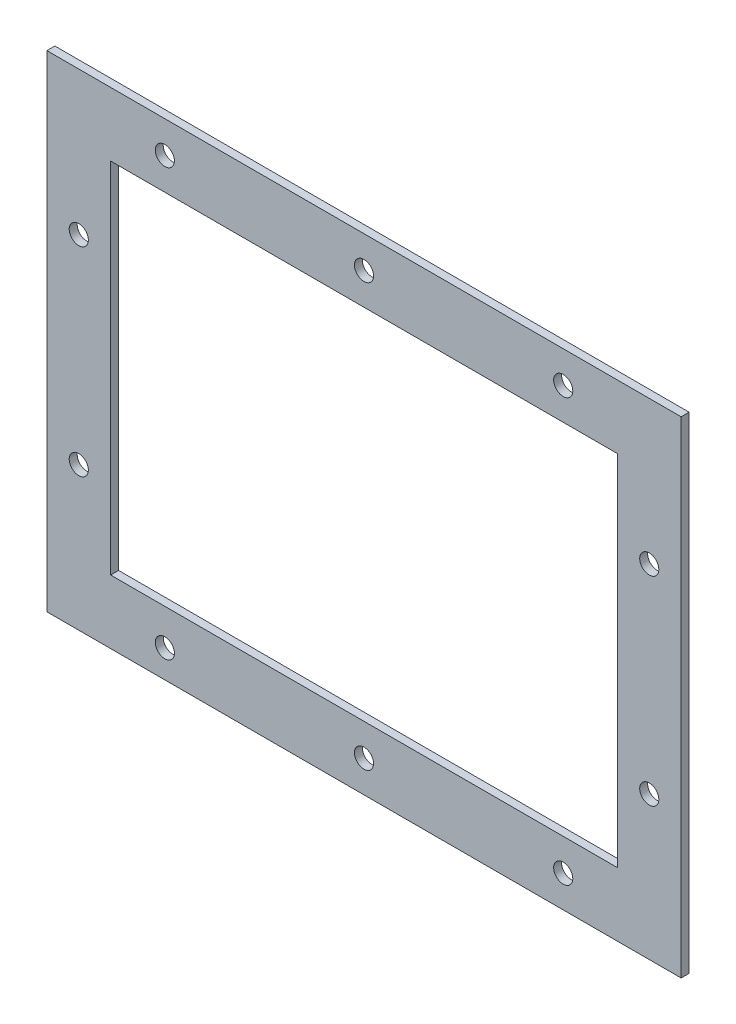
ISO-10303-21;
HEADER;
FILE_DESCRIPTION(('STEP AP214'),'2;1');
FILE_NAME('part.step','',(''),(''),'','','');
FILE_SCHEMA(('AUTOMOTIVE_DESIGN { 1 0 10303 214 1 1 1 1 }'));
ENDSEC;
DATA;
#1=APPLICATION_CONTEXT('core data for automotive mechanical design processes');
#2=APPLICATION_PROTOCOL_DEFINITION('international standard','automotive_design',2000,#1);
#3=PRODUCT_CONTEXT('',#1,'mechanical');
#4=PRODUCT('Part','Part','',(#3));
#5=PRODUCT_RELATED_PRODUCT_CATEGORY('part','',(#4));
#6=PRODUCT_DEFINITION_FORMATION('','',#4);
#7=PRODUCT_DEFINITION_CONTEXT('part definition',#1,'design');
#8=PRODUCT_DEFINITION('design','',#6,#7);
#9=PRODUCT_DEFINITION_SHAPE('','',#8);
#10=(LENGTH_UNIT() NAMED_UNIT(*) SI_UNIT(.MILLI.,.METRE.));
#11=(NAMED_UNIT(*) PLANE_ANGLE_UNIT() SI_UNIT($,.RADIAN.));
#12=(NAMED_UNIT(*) SI_UNIT($,.STERADIAN.) SOLID_ANGLE_UNIT());
#13=UNCERTAINTY_MEASURE_WITH_UNIT(LENGTH_MEASURE(1.E-05),#10,'distance_accuracy_value','');
#14=(GEOMETRIC_REPRESENTATION_CONTEXT(3) GLOBAL_UNCERTAINTY_ASSIGNED_CONTEXT((#13)) GLOBAL_UNIT_ASSIGNED_CONTEXT((#10,
#11,#12)) REPRESENTATION_CONTEXT('',''));
#15=CARTESIAN_POINT('',(0.,0.,0.));
#16=DIRECTION('',(0.,0.,1.));
#17=DIRECTION('',(1.,0.,0.));
#18=AXIS2_PLACEMENT_3D('',#15,#16,#17);
#19=CARTESIAN_POINT('',(0.,0.,5.));
#20=DIRECTION('',(0.,0.,1.));
#21=DIRECTION('',(1.,0.,0.));
#22=AXIS2_PLACEMENT_3D('',#19,#20,#21);
#23=PLANE('',#22);
#24=CARTESIAN_POINT('',(144.280112044818,-60.5,5.));
#25=DIRECTION('',(0.,0.,1.));
#26=DIRECTION('',(-1.,0.,0.));
#27=AXIS2_PLACEMENT_3D('',#24,#25,#26);
#28=CIRCLE('',#27,6.00000000000002);
#29=CARTESIAN_POINT('',(138.280112044818,-60.5,5.));
#30=VERTEX_POINT('',#29);
#31=EDGE_CURVE('E267',#30,#30,#28,.T.);
#32=ORIENTED_EDGE('',*,*,#31,.F.);
#33=EDGE_LOOP('',(#32));
#34=FACE_BOUND('',#33,.T.);
#35=CARTESIAN_POINT('',(-159.719887955182,134.5,5.));
#36=DIRECTION('',(0.,0.,1.));
#37=DIRECTION('',(1.,0.,0.));
#38=AXIS2_PLACEMENT_3D('',#35,#36,#37);
#39=CIRCLE('',#38,6.00000000000002);
#40=CARTESIAN_POINT('',(-153.719887955182,134.5,5.));
#41=VERTEX_POINT('',#40);
#42=EDGE_CURVE('E286',#41,#41,#39,.T.);
#43=ORIENTED_EDGE('',*,*,#42,.F.);
#44=EDGE_LOOP('',(#43));
#45=FACE_BOUND('',#44,.T.);
#46=CARTESIAN_POINT('',(90.2801120448178,-130.5,5.));
#47=DIRECTION('',(0.,0.,1.));
#48=DIRECTION('',(-1.,0.,0.));
#49=AXIS2_PLACEMENT_3D('',#46,#47,#48);
#50=CIRCLE('',#49,5.99999999999999);
#51=CARTESIAN_POINT('',(84.2801120448178,-130.5,5.));
#52=VERTEX_POINT('',#51);
#53=EDGE_CURVE('E280',#52,#52,#50,.T.);
#54=ORIENTED_EDGE('',*,*,#53,.F.);
#55=EDGE_LOOP('',(#54));
#56=FACE_BOUND('',#55,.T.);
#57=CARTESIAN_POINT('',(-34.7198879551822,-130.5,5.));
#58=DIRECTION('',(0.,0.,1.));
#59=DIRECTION('',(-1.,0.,0.));
#60=AXIS2_PLACEMENT_3D('',#57,#58,#59);
#61=CIRCLE('',#60,6.00000000000002);
#62=CARTESIAN_POINT('',(-40.7198879551822,-130.5,5.));
#63=VERTEX_POINT('',#62);
#64=EDGE_CURVE('E274',#63,#63,#61,.T.);
#65=ORIENTED_EDGE('',*,*,#64,.F.);
#66=EDGE_LOOP('',(#65));
#67=FACE_BOUND('',#66,.T.);
#68=CARTESIAN_POINT('',(-213.719887955182,-60.5,5.));
#69=DIRECTION('',(0.,0.,1.));
#70=DIRECTION('',(1.,0.,0.));
#71=AXIS2_PLACEMENT_3D('',#68,#69,#70);
#72=CIRCLE('',#71,6.00000000000002);
#73=CARTESIAN_POINT('',(-207.719887955182,-60.5,5.));
#74=VERTEX_POINT('',#73);
#75=EDGE_CURVE('E310',#74,#74,#72,.T.);
#76=ORIENTED_EDGE('',*,*,#75,.F.);
#77=EDGE_LOOP('',(#76));
#78=FACE_BOUND('',#77,.T.);
#79=CARTESIAN_POINT('',(90.2801120448178,134.5,5.));
#80=DIRECTION('',(0.,0.,1.));
#81=DIRECTION('',(1.,0.,0.));
#82=AXIS2_PLACEMENT_3D('',#79,#80,#81);
#83=CIRCLE('',#82,5.99999999999998);
#84=CARTESIAN_POINT('',(96.2801120448178,134.5,5.));
#85=VERTEX_POINT('',#84);
#86=EDGE_CURVE('E297',#85,#85,#83,.T.);
#87=ORIENTED_EDGE('',*,*,#86,.F.);
#88=EDGE_LOOP('',(#87));
#89=FACE_BOUND('',#88,.T.);
#90=CARTESIAN_POINT('',(-34.7198879551822,134.5,5.));
#91=DIRECTION('',(0.,0.,1.));
#92=DIRECTION('',(1.,0.,0.));
#93=AXIS2_PLACEMENT_3D('',#90,#91,#92);
#94=CIRCLE('',#93,6.00000000000002);
#95=CARTESIAN_POINT('',(-28.7198879551822,134.5,5.));
#96=VERTEX_POINT('',#95);
#97=EDGE_CURVE('E298',#96,#96,#94,.T.);
#98=ORIENTED_EDGE('',*,*,#97,.F.);
#99=EDGE_LOOP('',(#98));
#100=FACE_BOUND('',#99,.T.);
#101=CARTESIAN_POINT('',(-159.694305460668,-133.028827626507,5.));
#102=DIRECTION('',(0.,0.,1.));
#103=DIRECTION('',(-1.,0.,0.));
#104=AXIS2_PLACEMENT_3D('',#101,#102,#103);
#105=CIRCLE('',#104,6.00000000000002);
#106=CARTESIAN_POINT('',(-165.694305460668,-133.028827626507,5.));
#107=VERTEX_POINT('',#106);
#108=EDGE_CURVE('E273',#107,#107,#105,.T.);
#109=ORIENTED_EDGE('',*,*,#108,.F.);
#110=EDGE_LOOP('',(#109));
#111=FACE_BOUND('',#110,.T.);
#112=CARTESIAN_POINT('',(144.280112044818,64.5,5.));
#113=DIRECTION('',(0.,0.,1.));
#114=DIRECTION('',(-1.,0.,0.));
#115=AXIS2_PLACEMENT_3D('',#112,#113,#114);
#116=CIRCLE('',#115,6.00000000000002);
#117=CARTESIAN_POINT('',(138.280112044818,64.5,5.));
#118=VERTEX_POINT('',#117);
#119=EDGE_CURVE('E264',#118,#118,#116,.T.);
#120=ORIENTED_EDGE('',*,*,#119,.F.);
#121=EDGE_LOOP('',(#120));
#122=FACE_BOUND('',#121,.T.);
#123=CARTESIAN_POINT('',(-213.719887955182,64.5,5.));
#124=DIRECTION('',(0.,0.,1.));
#125=DIRECTION('',(1.,0.,0.));
#126=AXIS2_PLACEMENT_3D('',#123,#124,#125);
#127=CIRCLE('',#126,6.00000000000002);
#128=CARTESIAN_POINT('',(-207.719887955182,64.5,5.));
#129=VERTEX_POINT('',#128);
#130=EDGE_CURVE('E309',#129,#129,#127,.T.);
#131=ORIENTED_EDGE('',*,*,#130,.F.);
#132=EDGE_LOOP('',(#131));
#133=FACE_BOUND('',#132,.T.);
#134=DIRECTION('',(1.,0.,0.));
#135=VECTOR('',#134,1.);
#136=CARTESIAN_POINT('',(-233.719887955182,-150.5,5.));
#137=LINE('',#136,#135);
#138=CARTESIAN_POINT('',(-233.719887955182,-150.5,5.));
#139=VERTEX_POINT('',#138);
#140=CARTESIAN_POINT('',(164.280112044818,-150.5,5.));
#141=VERTEX_POINT('',#140);
#142=EDGE_CURVE('E137',#139,#141,#137,.T.);
#143=ORIENTED_EDGE('',*,*,#142,.T.);
#144=DIRECTION('',(0.,1.,0.));
#145=VECTOR('',#144,1.);
#146=CARTESIAN_POINT('',(164.280112044818,-150.5,5.));
#147=LINE('',#146,#145);
#148=CARTESIAN_POINT('',(164.280112044818,154.5,5.));
#149=VERTEX_POINT('',#148);
#150=EDGE_CURVE('E140',#141,#149,#147,.T.);
#151=ORIENTED_EDGE('',*,*,#150,.T.);
#152=DIRECTION('',(-1.,0.,0.));
#153=VECTOR('',#152,1.);
#154=CARTESIAN_POINT('',(-233.719887955182,154.5,5.));
#155=LINE('',#154,#153);
#156=CARTESIAN_POINT('',(-233.719887955182,154.5,5.));
#157=VERTEX_POINT('',#156);
#158=EDGE_CURVE('E143',#149,#157,#155,.T.);
#159=ORIENTED_EDGE('',*,*,#158,.T.);
#160=DIRECTION('',(0.,-1.,0.));
#161=VECTOR('',#160,1.);
#162=CARTESIAN_POINT('',(-233.719887955182,-150.5,5.));
#163=LINE('',#162,#161);
#164=EDGE_CURVE('E145',#157,#139,#163,.T.);
#165=ORIENTED_EDGE('',*,*,#164,.T.);
#166=EDGE_LOOP('',(#143,#151,#159,#165));
#167=FACE_BOUND('',#166,.T.);
#168=DIRECTION('',(-1.,0.,0.));
#169=VECTOR('',#168,1.);
#170=CARTESIAN_POINT('',(-193.719887955182,114.5,5.));
#171=LINE('',#170,#169);
#172=CARTESIAN_POINT('',(124.280112044818,114.5,5.));
#173=VERTEX_POINT('',#172);
#174=CARTESIAN_POINT('',(-193.719887955182,114.5,5.));
#175=VERTEX_POINT('',#174);
#176=EDGE_CURVE('E107',#173,#175,#171,.T.);
#177=ORIENTED_EDGE('',*,*,#176,.F.);
#178=DIRECTION('',(0.,1.,0.));
#179=VECTOR('',#178,1.);
#180=CARTESIAN_POINT('',(124.280112044818,-110.5,5.));
#181=LINE('',#180,#179);
#182=CARTESIAN_POINT('',(124.280112044818,-110.5,5.));
#183=VERTEX_POINT('',#182);
#184=EDGE_CURVE('E99',#183,#173,#181,.T.);
#185=ORIENTED_EDGE('',*,*,#184,.F.);
#186=DIRECTION('',(1.,0.,0.));
#187=VECTOR('',#186,1.);
#188=CARTESIAN_POINT('',(-193.719887955182,-110.5,5.));
#189=LINE('',#188,#187);
#190=CARTESIAN_POINT('',(-193.719887955182,-110.5,5.));
#191=VERTEX_POINT('',#190);
#192=EDGE_CURVE('E121',#191,#183,#189,.T.);
#193=ORIENTED_EDGE('',*,*,#192,.F.);
#194=DIRECTION('',(0.,-1.,0.));
#195=VECTOR('',#194,1.);
#196=CARTESIAN_POINT('',(-193.719887955182,-110.5,5.));
#197=LINE('',#196,#195);
#198=EDGE_CURVE('E119',#175,#191,#197,.T.);
#199=ORIENTED_EDGE('',*,*,#198,.F.);
#200=EDGE_LOOP('',(#177,#185,#193,#199));
#201=FACE_BOUND('',#200,.T.);
#202=ADVANCED_FACE('F34',(#34,#45,#56,#67,#78,#89,#100,#111,#122,#133,#167,#201),#23,.T.);
#203=CARTESIAN_POINT('',(0.,0.,0.));
#204=DIRECTION('',(0.,0.,1.));
#205=DIRECTION('',(1.,0.,0.));
#206=AXIS2_PLACEMENT_3D('',#203,#204,#205);
#207=PLANE('',#206);
#208=CARTESIAN_POINT('',(144.280112044818,-60.5,0.));
#209=DIRECTION('',(0.,0.,1.));
#210=DIRECTION('',(-1.,0.,0.));
#211=AXIS2_PLACEMENT_3D('',#208,#209,#210);
#212=CIRCLE('',#211,6.00000000000002);
#213=CARTESIAN_POINT('',(138.280112044818,-60.5,0.));
#214=VERTEX_POINT('',#213);
#215=EDGE_CURVE('E289',#214,#214,#212,.T.);
#216=ORIENTED_EDGE('',*,*,#215,.T.);
#217=EDGE_LOOP('',(#216));
#218=FACE_BOUND('',#217,.T.);
#219=CARTESIAN_POINT('',(-159.719887955182,134.5,0.));
#220=DIRECTION('',(0.,0.,1.));
#221=DIRECTION('',(1.,0.,0.));
#222=AXIS2_PLACEMENT_3D('',#219,#220,#221);
#223=CIRCLE('',#222,6.00000000000002);
#224=CARTESIAN_POINT('',(-153.719887955182,134.5,0.));
#225=VERTEX_POINT('',#224);
#226=EDGE_CURVE('E283',#225,#225,#223,.T.);
#227=ORIENTED_EDGE('',*,*,#226,.T.);
#228=EDGE_LOOP('',(#227));
#229=FACE_BOUND('',#228,.T.);
#230=CARTESIAN_POINT('',(90.2801120448178,-130.5,0.));
#231=DIRECTION('',(0.,0.,1.));
#232=DIRECTION('',(-1.,0.,0.));
#233=AXIS2_PLACEMENT_3D('',#230,#231,#232);
#234=CIRCLE('',#233,5.99999999999999);
#235=CARTESIAN_POINT('',(84.2801120448178,-130.5,0.));
#236=VERTEX_POINT('',#235);
#237=EDGE_CURVE('E277',#236,#236,#234,.T.);
#238=ORIENTED_EDGE('',*,*,#237,.T.);
#239=EDGE_LOOP('',(#238));
#240=FACE_BOUND('',#239,.T.);
#241=CARTESIAN_POINT('',(-34.7198879551822,-130.5,0.));
#242=DIRECTION('',(0.,0.,1.));
#243=DIRECTION('',(-1.,0.,0.));
#244=AXIS2_PLACEMENT_3D('',#241,#242,#243);
#245=CIRCLE('',#244,6.00000000000002);
#246=CARTESIAN_POINT('',(-40.7198879551822,-130.5,0.));
#247=VERTEX_POINT('',#246);
#248=EDGE_CURVE('E270',#247,#247,#245,.T.);
#249=ORIENTED_EDGE('',*,*,#248,.T.);
#250=EDGE_LOOP('',(#249));
#251=FACE_BOUND('',#250,.T.);
#252=CARTESIAN_POINT('',(-213.719887955182,-60.5,0.));
#253=DIRECTION('',(0.,0.,1.));
#254=DIRECTION('',(1.,0.,0.));
#255=AXIS2_PLACEMENT_3D('',#252,#253,#254);
#256=CIRCLE('',#255,6.00000000000002);
#257=CARTESIAN_POINT('',(-207.719887955182,-60.5,0.));
#258=VERTEX_POINT('',#257);
#259=EDGE_CURVE('E306',#258,#258,#256,.T.);
#260=ORIENTED_EDGE('',*,*,#259,.T.);
#261=EDGE_LOOP('',(#260));
#262=FACE_BOUND('',#261,.T.);
#263=CARTESIAN_POINT('',(90.2801120448178,134.5,0.));
#264=DIRECTION('',(0.,0.,1.));
#265=DIRECTION('',(1.,0.,0.));
#266=AXIS2_PLACEMENT_3D('',#263,#264,#265);
#267=CIRCLE('',#266,5.99999999999998);
#268=CARTESIAN_POINT('',(96.2801120448178,134.5,0.));
#269=VERTEX_POINT('',#268);
#270=EDGE_CURVE('E313',#269,#269,#267,.T.);
#271=ORIENTED_EDGE('',*,*,#270,.T.);
#272=EDGE_LOOP('',(#271));
#273=FACE_BOUND('',#272,.T.);
#274=CARTESIAN_POINT('',(-34.7198879551822,134.5,0.));
#275=DIRECTION('',(0.,0.,1.));
#276=DIRECTION('',(1.,0.,0.));
#277=AXIS2_PLACEMENT_3D('',#274,#275,#276);
#278=CIRCLE('',#277,6.00000000000002);
#279=CARTESIAN_POINT('',(-28.7198879551822,134.5,0.));
#280=VERTEX_POINT('',#279);
#281=EDGE_CURVE('E294',#280,#280,#278,.T.);
#282=ORIENTED_EDGE('',*,*,#281,.T.);
#283=EDGE_LOOP('',(#282));
#284=FACE_BOUND('',#283,.T.);
#285=CARTESIAN_POINT('',(-159.694305460668,-133.028827626507,0.));
#286=DIRECTION('',(0.,0.,1.));
#287=DIRECTION('',(-1.,0.,0.));
#288=AXIS2_PLACEMENT_3D('',#285,#286,#287);
#289=CIRCLE('',#288,6.00000000000002);
#290=CARTESIAN_POINT('',(-165.694305460668,-133.028827626507,0.));
#291=VERTEX_POINT('',#290);
#292=EDGE_CURVE('E301',#291,#291,#289,.T.);
#293=ORIENTED_EDGE('',*,*,#292,.T.);
#294=EDGE_LOOP('',(#293));
#295=FACE_BOUND('',#294,.T.);
#296=CARTESIAN_POINT('',(144.280112044818,64.5,0.));
#297=DIRECTION('',(0.,0.,1.));
#298=DIRECTION('',(-1.,0.,0.));
#299=AXIS2_PLACEMENT_3D('',#296,#297,#298);
#300=CIRCLE('',#299,6.00000000000002);
#301=CARTESIAN_POINT('',(138.280112044818,64.5,0.));
#302=VERTEX_POINT('',#301);
#303=EDGE_CURVE('E261',#302,#302,#300,.T.);
#304=ORIENTED_EDGE('',*,*,#303,.T.);
#305=EDGE_LOOP('',(#304));
#306=FACE_BOUND('',#305,.T.);
#307=CARTESIAN_POINT('',(-213.719887955182,64.5,0.));
#308=DIRECTION('',(0.,0.,1.));
#309=DIRECTION('',(1.,0.,0.));
#310=AXIS2_PLACEMENT_3D('',#307,#308,#309);
#311=CIRCLE('',#310,6.00000000000002);
#312=CARTESIAN_POINT('',(-207.719887955182,64.5,0.));
#313=VERTEX_POINT('',#312);
#314=EDGE_CURVE('E127',#313,#313,#311,.T.);
#315=ORIENTED_EDGE('',*,*,#314,.T.);
#316=EDGE_LOOP('',(#315));
#317=FACE_BOUND('',#316,.T.);
#318=DIRECTION('',(1.,0.,0.));
#319=VECTOR('',#318,1.);
#320=CARTESIAN_POINT('',(-233.719887955182,-150.5,0.));
#321=LINE('',#320,#319);
#322=CARTESIAN_POINT('',(-233.719887955182,-150.5,0.));
#323=VERTEX_POINT('',#322);
#324=CARTESIAN_POINT('',(164.280112044818,-150.5,0.));
#325=VERTEX_POINT('',#324);
#326=EDGE_CURVE('E115',#323,#325,#321,.T.);
#327=ORIENTED_EDGE('',*,*,#326,.F.);
#328=DIRECTION('',(0.,-1.,0.));
#329=VECTOR('',#328,1.);
#330=CARTESIAN_POINT('',(-233.719887955182,-150.5,0.));
#331=LINE('',#330,#329);
#332=CARTESIAN_POINT('',(-233.719887955182,154.5,0.));
#333=VERTEX_POINT('',#332);
#334=EDGE_CURVE('E141',#333,#323,#331,.T.);
#335=ORIENTED_EDGE('',*,*,#334,.F.);
#336=DIRECTION('',(-1.,0.,0.));
#337=VECTOR('',#336,1.);
#338=CARTESIAN_POINT('',(-233.719887955182,154.5,0.));
#339=LINE('',#338,#337);
#340=CARTESIAN_POINT('',(164.280112044818,154.5,0.));
#341=VERTEX_POINT('',#340);
#342=EDGE_CURVE('E152',#341,#333,#339,.T.);
#343=ORIENTED_EDGE('',*,*,#342,.F.);
#344=DIRECTION('',(0.,1.,0.));
#345=VECTOR('',#344,1.);
#346=CARTESIAN_POINT('',(164.280112044818,-150.5,0.));
#347=LINE('',#346,#345);
#348=EDGE_CURVE('E150',#325,#341,#347,.T.);
#349=ORIENTED_EDGE('',*,*,#348,.F.);
#350=EDGE_LOOP('',(#327,#335,#343,#349));
#351=FACE_BOUND('',#350,.T.);
#352=DIRECTION('',(0.,1.,0.));
#353=VECTOR('',#352,1.);
#354=CARTESIAN_POINT('',(124.280112044818,-110.5,0.));
#355=LINE('',#354,#353);
#356=CARTESIAN_POINT('',(124.280112044818,-110.5,0.));
#357=VERTEX_POINT('',#356);
#358=CARTESIAN_POINT('',(124.280112044818,114.5,0.));
#359=VERTEX_POINT('',#358);
#360=EDGE_CURVE('E57',#357,#359,#355,.T.);
#361=ORIENTED_EDGE('',*,*,#360,.T.);
#362=DIRECTION('',(-1.,0.,0.));
#363=VECTOR('',#362,1.);
#364=CARTESIAN_POINT('',(-193.719887955182,114.5,0.));
#365=LINE('',#364,#363);
#366=CARTESIAN_POINT('',(-193.719887955182,114.5,0.));
#367=VERTEX_POINT('',#366);
#368=EDGE_CURVE('E114',#359,#367,#365,.T.);
#369=ORIENTED_EDGE('',*,*,#368,.T.);
#370=DIRECTION('',(0.,-1.,0.));
#371=VECTOR('',#370,1.);
#372=CARTESIAN_POINT('',(-193.719887955182,-110.5,0.));
#373=LINE('',#372,#371);
#374=CARTESIAN_POINT('',(-193.719887955182,-110.5,0.));
#375=VERTEX_POINT('',#374);
#376=EDGE_CURVE('E129',#367,#375,#373,.T.);
#377=ORIENTED_EDGE('',*,*,#376,.T.);
#378=DIRECTION('',(1.,0.,0.));
#379=VECTOR('',#378,1.);
#380=CARTESIAN_POINT('',(-193.719887955182,-110.5,0.));
#381=LINE('',#380,#379);
#382=EDGE_CURVE('E108',#375,#357,#381,.T.);
#383=ORIENTED_EDGE('',*,*,#382,.T.);
#384=EDGE_LOOP('',(#361,#369,#377,#383));
#385=FACE_BOUND('',#384,.T.);
#386=ADVANCED_FACE('F170',(#218,#229,#240,#251,#262,#273,#284,#295,#306,#317,#351,#385),#207,.F.);
#387=CARTESIAN_POINT('',(-233.719887955182,-150.5,5.));
#388=DIRECTION('',(0.,1.,0.));
#389=DIRECTION('',(0.,0.,1.));
#390=AXIS2_PLACEMENT_3D('',#387,#388,#389);
#391=PLANE('',#390);
#392=ORIENTED_EDGE('',*,*,#326,.T.);
#393=DIRECTION('',(0.,0.,-1.));
#394=VECTOR('',#393,1.);
#395=CARTESIAN_POINT('',(164.280112044818,-150.5,5.));
#396=LINE('',#395,#394);
#397=EDGE_CURVE('E11',#141,#325,#396,.T.);
#398=ORIENTED_EDGE('',*,*,#397,.F.);
#399=ORIENTED_EDGE('',*,*,#142,.F.);
#400=DIRECTION('',(0.,0.,-1.));
#401=VECTOR('',#400,1.);
#402=CARTESIAN_POINT('',(-233.719887955182,-150.5,5.));
#403=LINE('',#402,#401);
#404=EDGE_CURVE('E147',#139,#323,#403,.T.);
#405=ORIENTED_EDGE('',*,*,#404,.T.);
#406=EDGE_LOOP('',(#392,#398,#399,#405));
#407=FACE_BOUND('',#406,.T.);
#408=ADVANCED_FACE('F36',(#407),#391,.F.);
#409=CARTESIAN_POINT('',(164.280112044818,-150.5,5.));
#410=DIRECTION('',(-1.,0.,0.));
#411=DIRECTION('',(0.,0.,1.));
#412=AXIS2_PLACEMENT_3D('',#409,#410,#411);
#413=PLANE('',#412);
#414=ORIENTED_EDGE('',*,*,#348,.T.);
#415=DIRECTION('',(0.,0.,-1.));
#416=VECTOR('',#415,1.);
#417=CARTESIAN_POINT('',(164.280112044818,154.5,5.));
#418=LINE('',#417,#416);
#419=EDGE_CURVE('E42',#149,#341,#418,.T.);
#420=ORIENTED_EDGE('',*,*,#419,.F.);
#421=ORIENTED_EDGE('',*,*,#150,.F.);
#422=ORIENTED_EDGE('',*,*,#397,.T.);
#423=EDGE_LOOP('',(#414,#420,#421,#422));
#424=FACE_BOUND('',#423,.T.);
#425=ADVANCED_FACE('F180',(#424),#413,.F.);
#426=CARTESIAN_POINT('',(-233.719887955182,154.5,5.));
#427=DIRECTION('',(0.,-1.,0.));
#428=DIRECTION('',(1.,0.,0.));
#429=AXIS2_PLACEMENT_3D('',#426,#427,#428);
#430=PLANE('',#429);
#431=ORIENTED_EDGE('',*,*,#342,.T.);
#432=DIRECTION('',(0.,0.,-1.));
#433=VECTOR('',#432,1.);
#434=CARTESIAN_POINT('',(-233.719887955182,154.5,5.));
#435=LINE('',#434,#433);
#436=EDGE_CURVE('E157',#157,#333,#435,.T.);
#437=ORIENTED_EDGE('',*,*,#436,.F.);
#438=ORIENTED_EDGE('',*,*,#158,.F.);
#439=ORIENTED_EDGE('',*,*,#419,.T.);
#440=EDGE_LOOP('',(#431,#437,#438,#439));
#441=FACE_BOUND('',#440,.T.);
#442=ADVANCED_FACE('F164',(#441),#430,.F.);
#443=CARTESIAN_POINT('',(-233.719887955182,-150.5,5.));
#444=DIRECTION('',(1.,0.,0.));
#445=DIRECTION('',(0.,0.,-1.));
#446=AXIS2_PLACEMENT_3D('',#443,#444,#445);
#447=PLANE('',#446);
#448=ORIENTED_EDGE('',*,*,#334,.T.);
#449=ORIENTED_EDGE('',*,*,#404,.F.);
#450=ORIENTED_EDGE('',*,*,#164,.F.);
#451=ORIENTED_EDGE('',*,*,#436,.T.);
#452=EDGE_LOOP('',(#448,#449,#450,#451));
#453=FACE_BOUND('',#452,.T.);
#454=ADVANCED_FACE('F174',(#453),#447,.F.);
#455=CARTESIAN_POINT('',(124.280112044818,-110.5,5.));
#456=DIRECTION('',(-1.,0.,0.));
#457=DIRECTION('',(0.,0.,1.));
#458=AXIS2_PLACEMENT_3D('',#455,#456,#457);
#459=PLANE('',#458);
#460=ORIENTED_EDGE('',*,*,#360,.F.);
#461=DIRECTION('',(0.,0.,-1.));
#462=VECTOR('',#461,1.);
#463=CARTESIAN_POINT('',(124.280112044818,-110.5,5.));
#464=LINE('',#463,#462);
#465=EDGE_CURVE('E103',#183,#357,#464,.T.);
#466=ORIENTED_EDGE('',*,*,#465,.F.);
#467=ORIENTED_EDGE('',*,*,#184,.T.);
#468=DIRECTION('',(0.,0.,-1.));
#469=VECTOR('',#468,1.);
#470=CARTESIAN_POINT('',(124.280112044818,114.5,5.));
#471=LINE('',#470,#469);
#472=EDGE_CURVE('E102',#173,#359,#471,.T.);
#473=ORIENTED_EDGE('',*,*,#472,.T.);
#474=EDGE_LOOP('',(#460,#466,#467,#473));
#475=FACE_BOUND('',#474,.T.);
#476=ADVANCED_FACE('F101',(#475),#459,.T.);
#477=CARTESIAN_POINT('',(-193.719887955182,114.5,5.));
#478=DIRECTION('',(0.,-1.,0.));
#479=DIRECTION('',(0.,0.,-1.));
#480=AXIS2_PLACEMENT_3D('',#477,#478,#479);
#481=PLANE('',#480);
#482=ORIENTED_EDGE('',*,*,#368,.F.);
#483=ORIENTED_EDGE('',*,*,#472,.F.);
#484=ORIENTED_EDGE('',*,*,#176,.T.);
#485=DIRECTION('',(0.,0.,-1.));
#486=VECTOR('',#485,1.);
#487=CARTESIAN_POINT('',(-193.719887955182,114.5,5.));
#488=LINE('',#487,#486);
#489=EDGE_CURVE('E116',#175,#367,#488,.T.);
#490=ORIENTED_EDGE('',*,*,#489,.T.);
#491=EDGE_LOOP('',(#482,#483,#484,#490));
#492=FACE_BOUND('',#491,.T.);
#493=ADVANCED_FACE('F111',(#492),#481,.T.);
#494=CARTESIAN_POINT('',(-193.719887955182,-110.5,5.));
#495=DIRECTION('',(1.,0.,0.));
#496=DIRECTION('',(0.,0.,-1.));
#497=AXIS2_PLACEMENT_3D('',#494,#495,#496);
#498=PLANE('',#497);
#499=ORIENTED_EDGE('',*,*,#376,.F.);
#500=ORIENTED_EDGE('',*,*,#489,.F.);
#501=ORIENTED_EDGE('',*,*,#198,.T.);
#502=DIRECTION('',(0.,0.,-1.));
#503=VECTOR('',#502,1.);
#504=CARTESIAN_POINT('',(-193.719887955182,-110.5,5.));
#505=LINE('',#504,#503);
#506=EDGE_CURVE('E49',#191,#375,#505,.T.);
#507=ORIENTED_EDGE('',*,*,#506,.T.);
#508=EDGE_LOOP('',(#499,#500,#501,#507));
#509=FACE_BOUND('',#508,.T.);
#510=ADVANCED_FACE('F207',(#509),#498,.T.);
#511=CARTESIAN_POINT('',(-193.719887955182,-110.5,5.));
#512=DIRECTION('',(0.,1.,0.));
#513=DIRECTION('',(0.,0.,1.));
#514=AXIS2_PLACEMENT_3D('',#511,#512,#513);
#515=PLANE('',#514);
#516=ORIENTED_EDGE('',*,*,#382,.F.);
#517=ORIENTED_EDGE('',*,*,#506,.F.);
#518=ORIENTED_EDGE('',*,*,#192,.T.);
#519=ORIENTED_EDGE('',*,*,#465,.T.);
#520=EDGE_LOOP('',(#516,#517,#518,#519));
#521=FACE_BOUND('',#520,.T.);
#522=ADVANCED_FACE('F211',(#521),#515,.T.);
#523=CARTESIAN_POINT('',(-213.719887955182,64.5,0.));
#524=DIRECTION('',(0.,0.,1.));
#525=DIRECTION('',(1.,0.,0.));
#526=AXIS2_PLACEMENT_3D('',#523,#524,#525);
#527=CYLINDRICAL_SURFACE('',#526,6.00000000000002);
#528=ORIENTED_EDGE('',*,*,#314,.F.);
#529=EDGE_LOOP('',(#528));
#530=FACE_BOUND('',#529,.T.);
#531=ORIENTED_EDGE('',*,*,#130,.T.);
#532=EDGE_LOOP('',(#531));
#533=FACE_BOUND('',#532,.T.);
#534=ADVANCED_FACE('F217',(#530,#533),#527,.F.);
#535=CARTESIAN_POINT('',(144.280112044818,64.5,0.));
#536=DIRECTION('',(0.,0.,1.));
#537=DIRECTION('',(1.,0.,0.));
#538=AXIS2_PLACEMENT_3D('',#535,#536,#537);
#539=CYLINDRICAL_SURFACE('',#538,6.00000000000002);
#540=ORIENTED_EDGE('',*,*,#303,.F.);
#541=EDGE_LOOP('',(#540));
#542=FACE_BOUND('',#541,.T.);
#543=ORIENTED_EDGE('',*,*,#119,.T.);
#544=EDGE_LOOP('',(#543));
#545=FACE_BOUND('',#544,.T.);
#546=ADVANCED_FACE('F220',(#542,#545),#539,.F.);
#547=CARTESIAN_POINT('',(-159.694305460668,-133.028827626507,0.));
#548=DIRECTION('',(0.,0.,1.));
#549=DIRECTION('',(1.,0.,0.));
#550=AXIS2_PLACEMENT_3D('',#547,#548,#549);
#551=CYLINDRICAL_SURFACE('',#550,6.00000000000002);
#552=ORIENTED_EDGE('',*,*,#292,.F.);
#553=EDGE_LOOP('',(#552));
#554=FACE_BOUND('',#553,.T.);
#555=ORIENTED_EDGE('',*,*,#108,.T.);
#556=EDGE_LOOP('',(#555));
#557=FACE_BOUND('',#556,.T.);
#558=ADVANCED_FACE('F232',(#554,#557),#551,.F.);
#559=CARTESIAN_POINT('',(-34.7198879551822,134.5,0.));
#560=DIRECTION('',(0.,0.,1.));
#561=DIRECTION('',(1.,0.,0.));
#562=AXIS2_PLACEMENT_3D('',#559,#560,#561);
#563=CYLINDRICAL_SURFACE('',#562,6.00000000000002);
#564=ORIENTED_EDGE('',*,*,#281,.F.);
#565=EDGE_LOOP('',(#564));
#566=FACE_BOUND('',#565,.T.);
#567=ORIENTED_EDGE('',*,*,#97,.T.);
#568=EDGE_LOOP('',(#567));
#569=FACE_BOUND('',#568,.T.);
#570=ADVANCED_FACE('F226',(#566,#569),#563,.F.);
#571=CARTESIAN_POINT('',(90.2801120448178,134.5,0.));
#572=DIRECTION('',(0.,0.,1.));
#573=DIRECTION('',(1.,0.,0.));
#574=AXIS2_PLACEMENT_3D('',#571,#572,#573);
#575=CYLINDRICAL_SURFACE('',#574,5.99999999999998);
#576=ORIENTED_EDGE('',*,*,#270,.F.);
#577=EDGE_LOOP('',(#576));
#578=FACE_BOUND('',#577,.T.);
#579=ORIENTED_EDGE('',*,*,#86,.T.);
#580=EDGE_LOOP('',(#579));
#581=FACE_BOUND('',#580,.T.);
#582=ADVANCED_FACE('F222',(#578,#581),#575,.F.);
#583=CARTESIAN_POINT('',(-213.719887955182,-60.5,0.));
#584=DIRECTION('',(0.,0.,1.));
#585=DIRECTION('',(1.,0.,0.));
#586=AXIS2_PLACEMENT_3D('',#583,#584,#585);
#587=CYLINDRICAL_SURFACE('',#586,6.00000000000002);
#588=ORIENTED_EDGE('',*,*,#259,.F.);
#589=EDGE_LOOP('',(#588));
#590=FACE_BOUND('',#589,.T.);
#591=ORIENTED_EDGE('',*,*,#75,.T.);
#592=EDGE_LOOP('',(#591));
#593=FACE_BOUND('',#592,.T.);
#594=ADVANCED_FACE('F225',(#590,#593),#587,.F.);
#595=CARTESIAN_POINT('',(-34.7198879551822,-130.5,0.));
#596=DIRECTION('',(0.,0.,1.));
#597=DIRECTION('',(1.,0.,0.));
#598=AXIS2_PLACEMENT_3D('',#595,#596,#597);
#599=CYLINDRICAL_SURFACE('',#598,6.00000000000002);
#600=ORIENTED_EDGE('',*,*,#248,.F.);
#601=EDGE_LOOP('',(#600));
#602=FACE_BOUND('',#601,.T.);
#603=ORIENTED_EDGE('',*,*,#64,.T.);
#604=EDGE_LOOP('',(#603));
#605=FACE_BOUND('',#604,.T.);
#606=ADVANCED_FACE('F230',(#602,#605),#599,.F.);
#607=CARTESIAN_POINT('',(90.2801120448178,-130.5,0.));
#608=DIRECTION('',(0.,0.,1.));
#609=DIRECTION('',(1.,0.,0.));
#610=AXIS2_PLACEMENT_3D('',#607,#608,#609);
#611=CYLINDRICAL_SURFACE('',#610,5.99999999999999);
#612=ORIENTED_EDGE('',*,*,#237,.F.);
#613=EDGE_LOOP('',(#612));
#614=FACE_BOUND('',#613,.T.);
#615=ORIENTED_EDGE('',*,*,#53,.T.);
#616=EDGE_LOOP('',(#615));
#617=FACE_BOUND('',#616,.T.);
#618=ADVANCED_FACE('F246',(#614,#617),#611,.F.);
#619=CARTESIAN_POINT('',(-159.719887955182,134.5,0.));
#620=DIRECTION('',(0.,0.,1.));
#621=DIRECTION('',(1.,0.,0.));
#622=AXIS2_PLACEMENT_3D('',#619,#620,#621);
#623=CYLINDRICAL_SURFACE('',#622,6.00000000000002);
#624=ORIENTED_EDGE('',*,*,#226,.F.);
#625=EDGE_LOOP('',(#624));
#626=FACE_BOUND('',#625,.T.);
#627=ORIENTED_EDGE('',*,*,#42,.T.);
#628=EDGE_LOOP('',(#627));
#629=FACE_BOUND('',#628,.T.);
#630=ADVANCED_FACE('F242',(#626,#629),#623,.F.);
#631=CARTESIAN_POINT('',(144.280112044818,-60.5,0.));
#632=DIRECTION('',(0.,0.,1.));
#633=DIRECTION('',(1.,0.,0.));
#634=AXIS2_PLACEMENT_3D('',#631,#632,#633);
#635=CYLINDRICAL_SURFACE('',#634,6.00000000000002);
#636=ORIENTED_EDGE('',*,*,#215,.F.);
#637=EDGE_LOOP('',(#636));
#638=FACE_BOUND('',#637,.T.);
#639=ORIENTED_EDGE('',*,*,#31,.T.);
#640=EDGE_LOOP('',(#639));
#641=FACE_BOUND('',#640,.T.);
#642=ADVANCED_FACE('F239',(#638,#641),#635,.F.);
#643=CLOSED_SHELL('',(#202,#386,#408,#425,#442,#454,#476,#493,#510,#522,#534,#546,#558,#570,
#582,#594,#606,#618,#630,#642));
#644=MANIFOLD_SOLID_BREP('B2',#643);
#645=ADVANCED_BREP_SHAPE_REPRESENTATION('',(#18,#644),#14);
#646=SHAPE_DEFINITION_REPRESENTATION(#9,#645);
ENDSEC;
END-ISO-10303-21;
